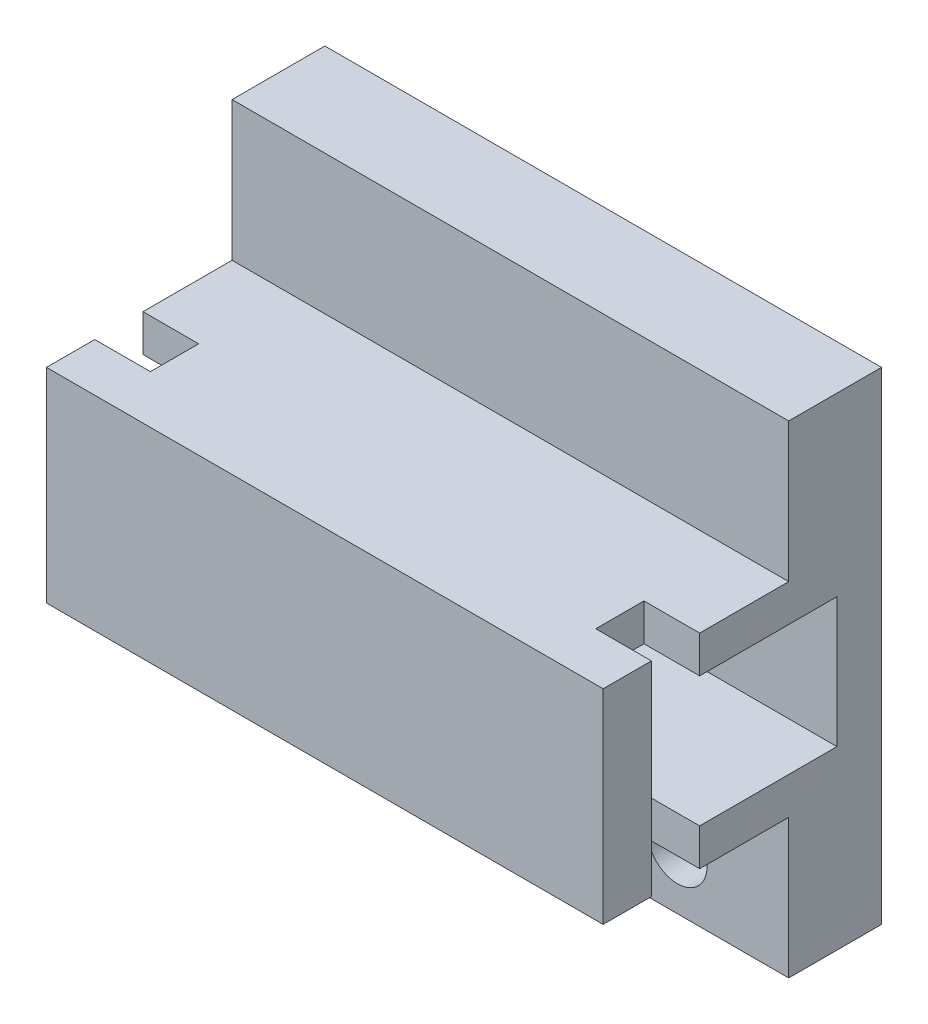
ISO-10303-21;
HEADER;
FILE_DESCRIPTION(('STEP AP214'),'2;1');
FILE_NAME('part.step','',(''),(''),'','','');
FILE_SCHEMA(('AUTOMOTIVE_DESIGN { 1 0 10303 214 1 1 1 1 }'));
ENDSEC;
DATA;
#1=APPLICATION_CONTEXT('core data for automotive mechanical design processes');
#2=APPLICATION_PROTOCOL_DEFINITION('international standard','automotive_design',2000,#1);
#3=PRODUCT_CONTEXT('',#1,'mechanical');
#4=PRODUCT('Part','Part','',(#3));
#5=PRODUCT_RELATED_PRODUCT_CATEGORY('part','',(#4));
#6=PRODUCT_DEFINITION_FORMATION('','',#4);
#7=PRODUCT_DEFINITION_CONTEXT('part definition',#1,'design');
#8=PRODUCT_DEFINITION('design','',#6,#7);
#9=PRODUCT_DEFINITION_SHAPE('','',#8);
#10=(LENGTH_UNIT() NAMED_UNIT(*) SI_UNIT(.MILLI.,.METRE.));
#11=(NAMED_UNIT(*) PLANE_ANGLE_UNIT() SI_UNIT($,.RADIAN.));
#12=(NAMED_UNIT(*) SI_UNIT($,.STERADIAN.) SOLID_ANGLE_UNIT());
#13=UNCERTAINTY_MEASURE_WITH_UNIT(LENGTH_MEASURE(1.E-05),#10,'distance_accuracy_value','');
#14=(GEOMETRIC_REPRESENTATION_CONTEXT(3) GLOBAL_UNCERTAINTY_ASSIGNED_CONTEXT((#13)) GLOBAL_UNIT_ASSIGNED_CONTEXT((#10,
#11,#12)) REPRESENTATION_CONTEXT('',''));
#15=CARTESIAN_POINT('',(0.,0.,0.));
#16=DIRECTION('',(0.,0.,1.));
#17=DIRECTION('',(1.,0.,0.));
#18=AXIS2_PLACEMENT_3D('',#15,#16,#17);
#19=CARTESIAN_POINT('',(-75.,-27.5,75.));
#20=DIRECTION('',(0.,1.,0.));
#21=DIRECTION('',(0.,0.,1.));
#22=AXIS2_PLACEMENT_3D('',#19,#20,#21);
#23=PLANE('',#22);
#24=DIRECTION('',(-1.,0.,0.));
#25=VECTOR('',#24,1.);
#26=CARTESIAN_POINT('',(-60.,-27.5,62.));
#27=LINE('',#26,#25);
#28=CARTESIAN_POINT('',(-60.,-27.5,62.));
#29=VERTEX_POINT('',#28);
#30=CARTESIAN_POINT('',(-75.,-27.5,62.));
#31=VERTEX_POINT('',#30);
#32=EDGE_CURVE('E249',#29,#31,#27,.T.);
#33=ORIENTED_EDGE('',*,*,#32,.F.);
#34=DIRECTION('',(0.,0.,-1.));
#35=VECTOR('',#34,1.);
#36=CARTESIAN_POINT('',(-60.,-27.5,62.));
#37=LINE('',#36,#35);
#38=CARTESIAN_POINT('',(-60.,-27.5,49.));
#39=VERTEX_POINT('',#38);
#40=EDGE_CURVE('E228',#29,#39,#37,.T.);
#41=ORIENTED_EDGE('',*,*,#40,.T.);
#42=DIRECTION('',(-1.,0.,0.));
#43=VECTOR('',#42,1.);
#44=CARTESIAN_POINT('',(-60.,-27.5,49.));
#45=LINE('',#44,#43);
#46=CARTESIAN_POINT('',(-75.,-27.5,49.));
#47=VERTEX_POINT('',#46);
#48=EDGE_CURVE('E251',#39,#47,#45,.T.);
#49=ORIENTED_EDGE('',*,*,#48,.T.);
#50=DIRECTION('',(0.,0.,-1.));
#51=VECTOR('',#50,1.);
#52=CARTESIAN_POINT('',(-75.,-27.5,75.));
#53=LINE('',#52,#51);
#54=CARTESIAN_POINT('',(-75.,-27.5,25.));
#55=VERTEX_POINT('',#54);
#56=EDGE_CURVE('E39',#47,#55,#53,.T.);
#57=ORIENTED_EDGE('',*,*,#56,.T.);
#58=DIRECTION('',(1.,0.,0.));
#59=VECTOR('',#58,1.);
#60=CARTESIAN_POINT('',(-75.,-27.5,25.));
#61=LINE('',#60,#59);
#62=CARTESIAN_POINT('',(-9.99999999999999,-27.5,25.));
#63=VERTEX_POINT('',#62);
#64=EDGE_CURVE('E344',#55,#63,#61,.T.);
#65=ORIENTED_EDGE('',*,*,#64,.T.);
#66=DIRECTION('',(0.,0.,-1.));
#67=VECTOR('',#66,1.);
#68=CARTESIAN_POINT('',(-9.99999999999999,-27.5,75.));
#69=LINE('',#68,#67);
#70=CARTESIAN_POINT('',(-10.,-27.5,75.));
#71=VERTEX_POINT('',#70);
#72=EDGE_CURVE('E319',#71,#63,#69,.T.);
#73=ORIENTED_EDGE('',*,*,#72,.F.);
#74=DIRECTION('',(1.,0.,0.));
#75=VECTOR('',#74,1.);
#76=CARTESIAN_POINT('',(-75.,-27.5,75.));
#77=LINE('',#76,#75);
#78=CARTESIAN_POINT('',(-75.,-27.5,75.));
#79=VERTEX_POINT('',#78);
#80=EDGE_CURVE('E349',#79,#71,#77,.T.);
#81=ORIENTED_EDGE('',*,*,#80,.F.);
#82=EDGE_CURVE('E375',#79,#31,#53,.T.);
#83=ORIENTED_EDGE('',*,*,#82,.T.);
#84=EDGE_LOOP('',(#33,#41,#49,#57,#65,#73,#81,#83));
#85=FACE_BOUND('',#84,.T.);
#86=ADVANCED_FACE('F35',(#85),#23,.F.);
#87=CARTESIAN_POINT('',(-75.,-65.,25.));
#88=DIRECTION('',(1.,0.,0.));
#89=DIRECTION('',(0.,0.,-1.));
#90=AXIS2_PLACEMENT_3D('',#87,#88,#89);
#91=PLANE('',#90);
#92=DIRECTION('',(0.,-1.,0.));
#93=VECTOR('',#92,1.);
#94=CARTESIAN_POINT('',(-75.,-65.,62.));
#95=LINE('',#94,#93);
#96=CARTESIAN_POINT('',(-75.,27.5,62.));
#97=VERTEX_POINT('',#96);
#98=EDGE_CURVE('E222',#97,#31,#95,.T.);
#99=ORIENTED_EDGE('',*,*,#98,.T.);
#100=ORIENTED_EDGE('',*,*,#82,.F.);
#101=DIRECTION('',(0.,-1.,0.));
#102=VECTOR('',#101,1.);
#103=CARTESIAN_POINT('',(-75.,-27.5,75.));
#104=LINE('',#103,#102);
#105=CARTESIAN_POINT('',(-75.,27.5,75.));
#106=VERTEX_POINT('',#105);
#107=EDGE_CURVE('E346',#106,#79,#104,.T.);
#108=ORIENTED_EDGE('',*,*,#107,.F.);
#109=DIRECTION('',(0.,0.,-1.));
#110=VECTOR('',#109,1.);
#111=CARTESIAN_POINT('',(-75.,27.5,75.));
#112=LINE('',#111,#110);
#113=EDGE_CURVE('E366',#106,#97,#112,.T.);
#114=ORIENTED_EDGE('',*,*,#113,.T.);
#115=EDGE_LOOP('',(#99,#100,#108,#114));
#116=FACE_BOUND('',#115,.T.);
#117=ADVANCED_FACE('F545',(#116),#91,.F.);
#118=DIRECTION('',(0.,1.,0.));
#119=VECTOR('',#118,1.);
#120=CARTESIAN_POINT('',(-75.,27.5,49.));
#121=LINE('',#120,#119);
#122=CARTESIAN_POINT('',(-75.,17.5,49.));
#123=VERTEX_POINT('',#122);
#124=CARTESIAN_POINT('',(-75.,27.5,49.));
#125=VERTEX_POINT('',#124);
#126=EDGE_CURVE('E248',#123,#125,#121,.T.);
#127=ORIENTED_EDGE('',*,*,#126,.T.);
#128=CARTESIAN_POINT('',(-75.,27.5,25.));
#129=VERTEX_POINT('',#128);
#130=EDGE_CURVE('E369',#125,#129,#112,.T.);
#131=ORIENTED_EDGE('',*,*,#130,.T.);
#132=DIRECTION('',(0.,-1.,0.));
#133=VECTOR('',#132,1.);
#134=CARTESIAN_POINT('',(-75.,-65.,25.));
#135=LINE('',#134,#133);
#136=CARTESIAN_POINT('',(-75.,65.,25.));
#137=VERTEX_POINT('',#136);
#138=EDGE_CURVE('E478',#137,#129,#135,.T.);
#139=ORIENTED_EDGE('',*,*,#138,.F.);
#140=DIRECTION('',(0.,0.,-1.));
#141=VECTOR('',#140,1.);
#142=CARTESIAN_POINT('',(-75.,65.,25.));
#143=LINE('',#142,#141);
#144=CARTESIAN_POINT('',(-75.,65.,0.));
#145=VERTEX_POINT('',#144);
#146=EDGE_CURVE('E498',#137,#145,#143,.T.);
#147=ORIENTED_EDGE('',*,*,#146,.T.);
#148=DIRECTION('',(0.,-1.,0.));
#149=VECTOR('',#148,1.);
#150=CARTESIAN_POINT('',(-75.,-65.,0.));
#151=LINE('',#150,#149);
#152=CARTESIAN_POINT('',(-75.,-65.,0.));
#153=VERTEX_POINT('',#152);
#154=EDGE_CURVE('E495',#145,#153,#151,.T.);
#155=ORIENTED_EDGE('',*,*,#154,.T.);
#156=DIRECTION('',(0.,0.,-1.));
#157=VECTOR('',#156,1.);
#158=CARTESIAN_POINT('',(-75.,-65.,25.));
#159=LINE('',#158,#157);
#160=CARTESIAN_POINT('',(-75.,-65.,25.));
#161=VERTEX_POINT('',#160);
#162=EDGE_CURVE('E492',#161,#153,#159,.T.);
#163=ORIENTED_EDGE('',*,*,#162,.F.);
#164=EDGE_CURVE('E363',#55,#161,#135,.T.);
#165=ORIENTED_EDGE('',*,*,#164,.F.);
#166=ORIENTED_EDGE('',*,*,#56,.F.);
#167=CARTESIAN_POINT('',(-75.,-17.5,49.));
#168=VERTEX_POINT('',#167);
#169=EDGE_CURVE('E245',#47,#168,#121,.T.);
#170=ORIENTED_EDGE('',*,*,#169,.T.);
#171=DIRECTION('',(0.,0.,-1.));
#172=VECTOR('',#171,1.);
#173=CARTESIAN_POINT('',(-75.,-17.5,25.));
#174=LINE('',#173,#172);
#175=CARTESIAN_POINT('',(-75.,-17.5,12.));
#176=VERTEX_POINT('',#175);
#177=EDGE_CURVE('E398',#168,#176,#174,.T.);
#178=ORIENTED_EDGE('',*,*,#177,.T.);
#179=DIRECTION('',(0.,1.,0.));
#180=VECTOR('',#179,1.);
#181=CARTESIAN_POINT('',(-75.,-65.,12.));
#182=LINE('',#181,#180);
#183=CARTESIAN_POINT('',(-75.,17.5,12.));
#184=VERTEX_POINT('',#183);
#185=EDGE_CURVE('E400',#176,#184,#182,.T.);
#186=ORIENTED_EDGE('',*,*,#185,.T.);
#187=DIRECTION('',(0.,0.,1.));
#188=VECTOR('',#187,1.);
#189=CARTESIAN_POINT('',(-75.,17.5,25.));
#190=LINE('',#189,#188);
#191=EDGE_CURVE('E404',#184,#123,#190,.T.);
#192=ORIENTED_EDGE('',*,*,#191,.T.);
#193=EDGE_LOOP('',(#127,#131,#139,#147,#155,#163,#165,#166,#170,#178,#186,#192));
#194=FACE_BOUND('',#193,.T.);
#195=ADVANCED_FACE('F433',(#194),#91,.F.);
#196=CARTESIAN_POINT('',(-75.,27.5,75.));
#197=DIRECTION('',(0.,-1.,0.));
#198=DIRECTION('',(0.,0.,-1.));
#199=AXIS2_PLACEMENT_3D('',#196,#197,#198);
#200=PLANE('',#199);
#201=DIRECTION('',(-1.,0.,0.));
#202=VECTOR('',#201,1.);
#203=CARTESIAN_POINT('',(-60.,27.5,62.));
#204=LINE('',#203,#202);
#205=CARTESIAN_POINT('',(-60.,27.5,62.));
#206=VERTEX_POINT('',#205);
#207=EDGE_CURVE('E216',#206,#97,#204,.T.);
#208=ORIENTED_EDGE('',*,*,#207,.T.);
#209=ORIENTED_EDGE('',*,*,#113,.F.);
#210=DIRECTION('',(-1.,0.,0.));
#211=VECTOR('',#210,1.);
#212=CARTESIAN_POINT('',(-75.,27.5,75.));
#213=LINE('',#212,#211);
#214=CARTESIAN_POINT('',(75.,27.5,75.));
#215=VERTEX_POINT('',#214);
#216=EDGE_CURVE('E343',#215,#106,#213,.T.);
#217=ORIENTED_EDGE('',*,*,#216,.F.);
#218=DIRECTION('',(0.,0.,-1.));
#219=VECTOR('',#218,1.);
#220=CARTESIAN_POINT('',(75.,27.5,75.));
#221=LINE('',#220,#219);
#222=CARTESIAN_POINT('',(75.,27.5,62.));
#223=VERTEX_POINT('',#222);
#224=EDGE_CURVE('E372',#215,#223,#221,.T.);
#225=ORIENTED_EDGE('',*,*,#224,.T.);
#226=DIRECTION('',(1.,0.,0.));
#227=VECTOR('',#226,1.);
#228=CARTESIAN_POINT('',(60.,27.5,62.));
#229=LINE('',#228,#227);
#230=CARTESIAN_POINT('',(60.,27.5,62.));
#231=VERTEX_POINT('',#230);
#232=EDGE_CURVE('E275',#231,#223,#229,.T.);
#233=ORIENTED_EDGE('',*,*,#232,.F.);
#234=DIRECTION('',(0.,0.,1.));
#235=VECTOR('',#234,1.);
#236=CARTESIAN_POINT('',(60.,27.5,62.));
#237=LINE('',#236,#235);
#238=CARTESIAN_POINT('',(60.,27.5,49.));
#239=VERTEX_POINT('',#238);
#240=EDGE_CURVE('E269',#239,#231,#237,.T.);
#241=ORIENTED_EDGE('',*,*,#240,.F.);
#242=DIRECTION('',(1.,0.,0.));
#243=VECTOR('',#242,1.);
#244=CARTESIAN_POINT('',(60.,27.5,49.));
#245=LINE('',#244,#243);
#246=CARTESIAN_POINT('',(75.,27.5,49.));
#247=VERTEX_POINT('',#246);
#248=EDGE_CURVE('E279',#239,#247,#245,.T.);
#249=ORIENTED_EDGE('',*,*,#248,.T.);
#250=CARTESIAN_POINT('',(75.,27.5,25.));
#251=VERTEX_POINT('',#250);
#252=EDGE_CURVE('E368',#247,#251,#221,.T.);
#253=ORIENTED_EDGE('',*,*,#252,.T.);
#254=DIRECTION('',(-1.,0.,0.));
#255=VECTOR('',#254,1.);
#256=CARTESIAN_POINT('',(-75.,27.5,25.));
#257=LINE('',#256,#255);
#258=EDGE_CURVE('E337',#251,#129,#257,.T.);
#259=ORIENTED_EDGE('',*,*,#258,.T.);
#260=ORIENTED_EDGE('',*,*,#130,.F.);
#261=DIRECTION('',(-1.,0.,0.));
#262=VECTOR('',#261,1.);
#263=CARTESIAN_POINT('',(-60.,27.5,49.));
#264=LINE('',#263,#262);
#265=CARTESIAN_POINT('',(-60.,27.5,49.));
#266=VERTEX_POINT('',#265);
#267=EDGE_CURVE('E227',#266,#125,#264,.T.);
#268=ORIENTED_EDGE('',*,*,#267,.F.);
#269=DIRECTION('',(0.,0.,1.));
#270=VECTOR('',#269,1.);
#271=CARTESIAN_POINT('',(-60.,27.5,62.));
#272=LINE('',#271,#270);
#273=EDGE_CURVE('E231',#266,#206,#272,.T.);
#274=ORIENTED_EDGE('',*,*,#273,.T.);
#275=EDGE_LOOP('',(#208,#209,#217,#225,#233,#241,#249,#253,#259,#260,#268,#274));
#276=FACE_BOUND('',#275,.T.);
#277=ADVANCED_FACE('F236',(#276),#200,.F.);
#278=CARTESIAN_POINT('',(-75.00005,17.5,12.));
#279=DIRECTION('',(0.,1.,0.));
#280=DIRECTION('',(0.,0.,1.));
#281=AXIS2_PLACEMENT_3D('',#278,#279,#280);
#282=PLANE('',#281);
#283=DIRECTION('',(1.,0.,0.));
#284=VECTOR('',#283,1.);
#285=CARTESIAN_POINT('',(-75.00005,17.5,49.));
#286=LINE('',#285,#284);
#287=CARTESIAN_POINT('',(-60.,17.5,49.));
#288=VERTEX_POINT('',#287);
#289=EDGE_CURVE('E256',#123,#288,#286,.T.);
#290=ORIENTED_EDGE('',*,*,#289,.F.);
#291=ORIENTED_EDGE('',*,*,#191,.F.);
#292=DIRECTION('',(1.,0.,0.));
#293=VECTOR('',#292,1.);
#294=CARTESIAN_POINT('',(-75.00005,17.5,12.));
#295=LINE('',#294,#293);
#296=CARTESIAN_POINT('',(75.,17.5,12.));
#297=VERTEX_POINT('',#296);
#298=EDGE_CURVE('E304',#184,#297,#295,.T.);
#299=ORIENTED_EDGE('',*,*,#298,.T.);
#300=DIRECTION('',(0.,0.,1.));
#301=VECTOR('',#300,1.);
#302=CARTESIAN_POINT('',(75.,17.5,12.));
#303=LINE('',#302,#301);
#304=CARTESIAN_POINT('',(75.,17.5,49.));
#305=VERTEX_POINT('',#304);
#306=EDGE_CURVE('E297',#297,#305,#303,.T.);
#307=ORIENTED_EDGE('',*,*,#306,.T.);
#308=DIRECTION('',(-1.,0.,0.));
#309=VECTOR('',#308,1.);
#310=CARTESIAN_POINT('',(-75.00005,17.5,49.));
#311=LINE('',#310,#309);
#312=CARTESIAN_POINT('',(60.,17.5,49.));
#313=VERTEX_POINT('',#312);
#314=EDGE_CURVE('E287',#305,#313,#311,.T.);
#315=ORIENTED_EDGE('',*,*,#314,.T.);
#316=DIRECTION('',(0.,0.,-1.));
#317=VECTOR('',#316,1.);
#318=CARTESIAN_POINT('',(60.,17.5,12.));
#319=LINE('',#318,#317);
#320=CARTESIAN_POINT('',(60.,17.5,62.));
#321=VERTEX_POINT('',#320);
#322=EDGE_CURVE('E278',#321,#313,#319,.T.);
#323=ORIENTED_EDGE('',*,*,#322,.F.);
#324=DIRECTION('',(1.,0.,0.));
#325=VECTOR('',#324,1.);
#326=CARTESIAN_POINT('',(-75.00005,17.5,62.));
#327=LINE('',#326,#325);
#328=CARTESIAN_POINT('',(-60.,17.5,62.));
#329=VERTEX_POINT('',#328);
#330=EDGE_CURVE('E301',#329,#321,#327,.T.);
#331=ORIENTED_EDGE('',*,*,#330,.F.);
#332=DIRECTION('',(0.,0.,1.));
#333=VECTOR('',#332,1.);
#334=CARTESIAN_POINT('',(-60.,17.5,12.));
#335=LINE('',#334,#333);
#336=EDGE_CURVE('E234',#288,#329,#335,.T.);
#337=ORIENTED_EDGE('',*,*,#336,.F.);
#338=EDGE_LOOP('',(#290,#291,#299,#307,#315,#323,#331,#337));
#339=FACE_BOUND('',#338,.T.);
#340=ADVANCED_FACE('F621',(#339),#282,.F.);
#341=CARTESIAN_POINT('',(-75.00005,-17.5,12.));
#342=DIRECTION('',(0.,-1.,0.));
#343=DIRECTION('',(0.,0.,-1.));
#344=AXIS2_PLACEMENT_3D('',#341,#342,#343);
#345=PLANE('',#344);
#346=DIRECTION('',(-1.,0.,0.));
#347=VECTOR('',#346,1.);
#348=CARTESIAN_POINT('',(-75.00005,-17.5,49.));
#349=LINE('',#348,#347);
#350=CARTESIAN_POINT('',(-60.,-17.5,49.));
#351=VERTEX_POINT('',#350);
#352=EDGE_CURVE('E11',#351,#168,#349,.T.);
#353=ORIENTED_EDGE('',*,*,#352,.F.);
#354=DIRECTION('',(0.,0.,-1.));
#355=VECTOR('',#354,1.);
#356=CARTESIAN_POINT('',(-60.,-17.5,12.));
#357=LINE('',#356,#355);
#358=CARTESIAN_POINT('',(-60.,-17.5,62.));
#359=VERTEX_POINT('',#358);
#360=EDGE_CURVE('E45',#359,#351,#357,.T.);
#361=ORIENTED_EDGE('',*,*,#360,.F.);
#362=DIRECTION('',(1.,0.,0.));
#363=VECTOR('',#362,1.);
#364=CARTESIAN_POINT('',(-75.00005,-17.5,62.));
#365=LINE('',#364,#363);
#366=CARTESIAN_POINT('',(60.,-17.5,62.));
#367=VERTEX_POINT('',#366);
#368=EDGE_CURVE('E300',#359,#367,#365,.T.);
#369=ORIENTED_EDGE('',*,*,#368,.T.);
#370=DIRECTION('',(0.,0.,1.));
#371=VECTOR('',#370,1.);
#372=CARTESIAN_POINT('',(60.,-17.5,12.));
#373=LINE('',#372,#371);
#374=CARTESIAN_POINT('',(60.,-17.5,49.));
#375=VERTEX_POINT('',#374);
#376=EDGE_CURVE('E408',#375,#367,#373,.T.);
#377=ORIENTED_EDGE('',*,*,#376,.F.);
#378=DIRECTION('',(1.,0.,0.));
#379=VECTOR('',#378,1.);
#380=CARTESIAN_POINT('',(-75.00005,-17.5,49.));
#381=LINE('',#380,#379);
#382=CARTESIAN_POINT('',(75.,-17.5,49.));
#383=VERTEX_POINT('',#382);
#384=EDGE_CURVE('E378',#375,#383,#381,.T.);
#385=ORIENTED_EDGE('',*,*,#384,.T.);
#386=DIRECTION('',(0.,0.,-1.));
#387=VECTOR('',#386,1.);
#388=CARTESIAN_POINT('',(75.,-17.5,12.));
#389=LINE('',#388,#387);
#390=CARTESIAN_POINT('',(75.,-17.5,12.));
#391=VERTEX_POINT('',#390);
#392=EDGE_CURVE('E292',#383,#391,#389,.T.);
#393=ORIENTED_EDGE('',*,*,#392,.T.);
#394=DIRECTION('',(1.,0.,0.));
#395=VECTOR('',#394,1.);
#396=CARTESIAN_POINT('',(-75.00005,-17.5,12.));
#397=LINE('',#396,#395);
#398=EDGE_CURVE('E306',#176,#391,#397,.T.);
#399=ORIENTED_EDGE('',*,*,#398,.F.);
#400=ORIENTED_EDGE('',*,*,#177,.F.);
#401=EDGE_LOOP('',(#353,#361,#369,#377,#385,#393,#399,#400));
#402=FACE_BOUND('',#401,.T.);
#403=ADVANCED_FACE('F416',(#402),#345,.F.);
#404=CARTESIAN_POINT('',(75.,-65.,25.));
#405=DIRECTION('',(-1.,0.,0.));
#406=DIRECTION('',(0.,0.,1.));
#407=AXIS2_PLACEMENT_3D('',#404,#405,#406);
#408=PLANE('',#407);
#409=DIRECTION('',(0.,0.,-1.));
#410=VECTOR('',#409,1.);
#411=CARTESIAN_POINT('',(75.,-27.5,75.));
#412=LINE('',#411,#410);
#413=CARTESIAN_POINT('',(75.,-27.5,75.));
#414=VERTEX_POINT('',#413);
#415=CARTESIAN_POINT('',(75.,-27.5,62.));
#416=VERTEX_POINT('',#415);
#417=EDGE_CURVE('E387',#414,#416,#412,.T.);
#418=ORIENTED_EDGE('',*,*,#417,.T.);
#419=DIRECTION('',(0.,-1.,0.));
#420=VECTOR('',#419,1.);
#421=CARTESIAN_POINT('',(75.,-17.5,62.));
#422=LINE('',#421,#420);
#423=EDGE_CURVE('E290',#223,#416,#422,.T.);
#424=ORIENTED_EDGE('',*,*,#423,.F.);
#425=ORIENTED_EDGE('',*,*,#224,.F.);
#426=DIRECTION('',(0.,1.,0.));
#427=VECTOR('',#426,1.);
#428=CARTESIAN_POINT('',(75.,-27.5,75.));
#429=LINE('',#428,#427);
#430=EDGE_CURVE('E340',#414,#215,#429,.T.);
#431=ORIENTED_EDGE('',*,*,#430,.F.);
#432=EDGE_LOOP('',(#418,#424,#425,#431));
#433=FACE_BOUND('',#432,.T.);
#434=ADVANCED_FACE('F533',(#433),#408,.F.);
#435=CARTESIAN_POINT('',(0.,0.,25.));
#436=DIRECTION('',(0.,0.,-1.));
#437=DIRECTION('',(-1.,0.,0.));
#438=AXIS2_PLACEMENT_3D('',#435,#436,#437);
#439=PLANE('',#438);
#440=DIRECTION('',(0.,-1.,0.));
#441=VECTOR('',#440,1.);
#442=CARTESIAN_POINT('',(-10.,0.,25.));
#443=LINE('',#442,#441);
#444=CARTESIAN_POINT('',(-10.,-65.,25.));
#445=VERTEX_POINT('',#444);
#446=EDGE_CURVE('E323',#63,#445,#443,.T.);
#447=ORIENTED_EDGE('',*,*,#446,.F.);
#448=ORIENTED_EDGE('',*,*,#64,.F.);
#449=ORIENTED_EDGE('',*,*,#164,.T.);
#450=DIRECTION('',(1.,0.,0.));
#451=VECTOR('',#450,1.);
#452=CARTESIAN_POINT('',(-75.,-65.,25.));
#453=LINE('',#452,#451);
#454=EDGE_CURVE('E475',#161,#445,#453,.T.);
#455=ORIENTED_EDGE('',*,*,#454,.T.);
#456=EDGE_LOOP('',(#447,#448,#449,#455));
#457=FACE_BOUND('',#456,.T.);
#458=CARTESIAN_POINT('',(-45.,-50.,25.));
#459=DIRECTION('',(0.,0.,-1.));
#460=DIRECTION('',(-1.,0.,0.));
#461=AXIS2_PLACEMENT_3D('',#458,#459,#460);
#462=CIRCLE('',#461,8.);
#463=CARTESIAN_POINT('',(-53.,-50.,25.));
#464=VERTEX_POINT('',#463);
#465=EDGE_CURVE('E303',#464,#464,#462,.T.);
#466=ORIENTED_EDGE('',*,*,#465,.T.);
#467=EDGE_LOOP('',(#466));
#468=FACE_BOUND('',#467,.T.);
#469=ADVANCED_FACE('F488',(#457,#468),#439,.F.);
#470=CARTESIAN_POINT('',(0.,0.,0.));
#471=DIRECTION('',(0.,0.,-1.));
#472=DIRECTION('',(-1.,0.,0.));
#473=AXIS2_PLACEMENT_3D('',#470,#471,#472);
#474=PLANE('',#473);
#475=CARTESIAN_POINT('',(45.,-50.,0.));
#476=DIRECTION('',(0.,0.,1.));
#477=DIRECTION('',(1.,0.,0.));
#478=AXIS2_PLACEMENT_3D('',#475,#476,#477);
#479=CIRCLE('',#478,8.);
#480=CARTESIAN_POINT('',(53.,-50.,0.));
#481=VERTEX_POINT('',#480);
#482=EDGE_CURVE('E334',#481,#481,#479,.T.);
#483=ORIENTED_EDGE('',*,*,#482,.T.);
#484=EDGE_LOOP('',(#483));
#485=FACE_BOUND('',#484,.T.);
#486=DIRECTION('',(0.,1.,0.));
#487=VECTOR('',#486,1.);
#488=CARTESIAN_POINT('',(75.,-65.,0.));
#489=LINE('',#488,#487);
#490=CARTESIAN_POINT('',(75.,-65.,0.));
#491=VERTEX_POINT('',#490);
#492=CARTESIAN_POINT('',(75.,65.,0.));
#493=VERTEX_POINT('',#492);
#494=EDGE_CURVE('E514',#491,#493,#489,.T.);
#495=ORIENTED_EDGE('',*,*,#494,.F.);
#496=DIRECTION('',(1.,0.,0.));
#497=VECTOR('',#496,1.);
#498=CARTESIAN_POINT('',(-75.,-65.,0.));
#499=LINE('',#498,#497);
#500=EDGE_CURVE('E467',#153,#491,#499,.T.);
#501=ORIENTED_EDGE('',*,*,#500,.F.);
#502=ORIENTED_EDGE('',*,*,#154,.F.);
#503=DIRECTION('',(-1.,0.,0.));
#504=VECTOR('',#503,1.);
#505=CARTESIAN_POINT('',(-75.,65.,0.));
#506=LINE('',#505,#504);
#507=EDGE_CURVE('E512',#493,#145,#506,.T.);
#508=ORIENTED_EDGE('',*,*,#507,.F.);
#509=EDGE_LOOP('',(#495,#501,#502,#508));
#510=FACE_BOUND('',#509,.T.);
#511=CARTESIAN_POINT('',(-45.,-50.,0.));
#512=DIRECTION('',(0.,0.,-1.));
#513=DIRECTION('',(-1.,0.,0.));
#514=AXIS2_PLACEMENT_3D('',#511,#512,#513);
#515=CIRCLE('',#514,8.);
#516=CARTESIAN_POINT('',(-53.,-50.,0.));
#517=VERTEX_POINT('',#516);
#518=EDGE_CURVE('E310',#517,#517,#515,.T.);
#519=ORIENTED_EDGE('',*,*,#518,.F.);
#520=EDGE_LOOP('',(#519));
#521=FACE_BOUND('',#520,.T.);
#522=ADVANCED_FACE('F518',(#485,#510,#521),#474,.T.);
#523=CARTESIAN_POINT('',(45.,-50.,25.));
#524=DIRECTION('',(0.,0.,1.));
#525=DIRECTION('',(1.,0.,0.));
#526=AXIS2_PLACEMENT_3D('',#523,#524,#525);
#527=CIRCLE('',#526,8.);
#528=CARTESIAN_POINT('',(53.,-50.,25.));
#529=VERTEX_POINT('',#528);
#530=EDGE_CURVE('E333',#529,#529,#527,.T.);
#531=ORIENTED_EDGE('',*,*,#530,.F.);
#532=EDGE_LOOP('',(#531));
#533=FACE_BOUND('',#532,.T.);
#534=CARTESIAN_POINT('',(9.99999999999999,-27.5,25.));
#535=VERTEX_POINT('',#534);
#536=CARTESIAN_POINT('',(75.,-27.5,25.));
#537=VERTEX_POINT('',#536);
#538=EDGE_CURVE('E362',#535,#537,#61,.T.);
#539=ORIENTED_EDGE('',*,*,#538,.F.);
#540=DIRECTION('',(0.,-1.,0.));
#541=VECTOR('',#540,1.);
#542=CARTESIAN_POINT('',(10.,0.,25.));
#543=LINE('',#542,#541);
#544=CARTESIAN_POINT('',(10.,-65.,25.));
#545=VERTEX_POINT('',#544);
#546=EDGE_CURVE('E328',#535,#545,#543,.T.);
#547=ORIENTED_EDGE('',*,*,#546,.T.);
#548=CARTESIAN_POINT('',(75.,-65.,25.));
#549=VERTEX_POINT('',#548);
#550=EDGE_CURVE('E480',#545,#549,#453,.T.);
#551=ORIENTED_EDGE('',*,*,#550,.T.);
#552=DIRECTION('',(0.,1.,0.));
#553=VECTOR('',#552,1.);
#554=CARTESIAN_POINT('',(75.,-65.,25.));
#555=LINE('',#554,#553);
#556=EDGE_CURVE('E457',#549,#537,#555,.T.);
#557=ORIENTED_EDGE('',*,*,#556,.T.);
#558=EDGE_LOOP('',(#539,#547,#551,#557));
#559=FACE_BOUND('',#558,.T.);
#560=ADVANCED_FACE('F521',(#533,#559),#439,.F.);
#561=DIRECTION('',(-1.,0.,0.));
#562=VECTOR('',#561,1.);
#563=CARTESIAN_POINT('',(-75.,65.,25.));
#564=LINE('',#563,#562);
#565=CARTESIAN_POINT('',(75.,65.,25.));
#566=VERTEX_POINT('',#565);
#567=EDGE_CURVE('E463',#566,#137,#564,.T.);
#568=ORIENTED_EDGE('',*,*,#567,.T.);
#569=ORIENTED_EDGE('',*,*,#138,.T.);
#570=ORIENTED_EDGE('',*,*,#258,.F.);
#571=EDGE_CURVE('E464',#251,#566,#555,.T.);
#572=ORIENTED_EDGE('',*,*,#571,.T.);
#573=EDGE_LOOP('',(#568,#569,#570,#572));
#574=FACE_BOUND('',#573,.T.);
#575=ADVANCED_FACE('F535',(#574),#439,.F.);
#576=ORIENTED_EDGE('',*,*,#252,.F.);
#577=DIRECTION('',(0.,1.,0.));
#578=VECTOR('',#577,1.);
#579=CARTESIAN_POINT('',(75.,27.5,49.));
#580=LINE('',#579,#578);
#581=EDGE_CURVE('E258',#305,#247,#580,.T.);
#582=ORIENTED_EDGE('',*,*,#581,.F.);
#583=ORIENTED_EDGE('',*,*,#306,.F.);
#584=DIRECTION('',(0.,1.,0.));
#585=VECTOR('',#584,1.);
#586=CARTESIAN_POINT('',(75.,-17.5,12.));
#587=LINE('',#586,#585);
#588=EDGE_CURVE('E294',#391,#297,#587,.T.);
#589=ORIENTED_EDGE('',*,*,#588,.F.);
#590=ORIENTED_EDGE('',*,*,#392,.F.);
#591=CARTESIAN_POINT('',(75.,-27.5,49.));
#592=VERTEX_POINT('',#591);
#593=EDGE_CURVE('E273',#592,#383,#580,.T.);
#594=ORIENTED_EDGE('',*,*,#593,.F.);
#595=EDGE_CURVE('E352',#592,#537,#412,.T.);
#596=ORIENTED_EDGE('',*,*,#595,.T.);
#597=ORIENTED_EDGE('',*,*,#556,.F.);
#598=DIRECTION('',(0.,0.,-1.));
#599=VECTOR('',#598,1.);
#600=CARTESIAN_POINT('',(75.,-65.,25.));
#601=LINE('',#600,#599);
#602=EDGE_CURVE('E460',#549,#491,#601,.T.);
#603=ORIENTED_EDGE('',*,*,#602,.T.);
#604=ORIENTED_EDGE('',*,*,#494,.T.);
#605=DIRECTION('',(0.,0.,-1.));
#606=VECTOR('',#605,1.);
#607=CARTESIAN_POINT('',(75.,65.,25.));
#608=LINE('',#607,#606);
#609=EDGE_CURVE('E401',#566,#493,#608,.T.);
#610=ORIENTED_EDGE('',*,*,#609,.F.);
#611=ORIENTED_EDGE('',*,*,#571,.F.);
#612=EDGE_LOOP('',(#576,#582,#583,#589,#590,#594,#596,#597,#603,#604,#610,#611));
#613=FACE_BOUND('',#612,.T.);
#614=ADVANCED_FACE('F37',(#613),#408,.F.);
#615=CARTESIAN_POINT('',(-75.,65.,25.));
#616=DIRECTION('',(0.,-1.,0.));
#617=DIRECTION('',(0.,0.,-1.));
#618=AXIS2_PLACEMENT_3D('',#615,#616,#617);
#619=PLANE('',#618);
#620=ORIENTED_EDGE('',*,*,#507,.T.);
#621=ORIENTED_EDGE('',*,*,#146,.F.);
#622=ORIENTED_EDGE('',*,*,#567,.F.);
#623=ORIENTED_EDGE('',*,*,#609,.T.);
#624=EDGE_LOOP('',(#620,#621,#622,#623));
#625=FACE_BOUND('',#624,.T.);
#626=ADVANCED_FACE('F511',(#625),#619,.F.);
#627=CARTESIAN_POINT('',(-75.,-65.,25.));
#628=DIRECTION('',(0.,1.,0.));
#629=DIRECTION('',(0.,0.,1.));
#630=AXIS2_PLACEMENT_3D('',#627,#628,#629);
#631=PLANE('',#630);
#632=ORIENTED_EDGE('',*,*,#550,.F.);
#633=DIRECTION('',(1.,0.,0.));
#634=VECTOR('',#633,1.);
#635=CARTESIAN_POINT('',(-75.,-65.,25.));
#636=LINE('',#635,#634);
#637=EDGE_CURVE('E331',#445,#545,#636,.T.);
#638=ORIENTED_EDGE('',*,*,#637,.F.);
#639=ORIENTED_EDGE('',*,*,#454,.F.);
#640=ORIENTED_EDGE('',*,*,#162,.T.);
#641=ORIENTED_EDGE('',*,*,#500,.T.);
#642=ORIENTED_EDGE('',*,*,#602,.F.);
#643=EDGE_LOOP('',(#632,#638,#639,#640,#641,#642));
#644=FACE_BOUND('',#643,.T.);
#645=ADVANCED_FACE('F502',(#644),#631,.F.);
#646=DIRECTION('',(0.,0.,-1.));
#647=VECTOR('',#646,1.);
#648=CARTESIAN_POINT('',(60.,-27.5,62.));
#649=LINE('',#648,#647);
#650=CARTESIAN_POINT('',(60.,-27.5,62.));
#651=VERTEX_POINT('',#650);
#652=CARTESIAN_POINT('',(60.,-27.5,49.));
#653=VERTEX_POINT('',#652);
#654=EDGE_CURVE('E262',#651,#653,#649,.T.);
#655=ORIENTED_EDGE('',*,*,#654,.F.);
#656=DIRECTION('',(1.,0.,0.));
#657=VECTOR('',#656,1.);
#658=CARTESIAN_POINT('',(60.,-27.5,62.));
#659=LINE('',#658,#657);
#660=EDGE_CURVE('E272',#651,#416,#659,.T.);
#661=ORIENTED_EDGE('',*,*,#660,.T.);
#662=ORIENTED_EDGE('',*,*,#417,.F.);
#663=CARTESIAN_POINT('',(9.99999999999999,-27.5,75.));
#664=VERTEX_POINT('',#663);
#665=EDGE_CURVE('E348',#664,#414,#77,.T.);
#666=ORIENTED_EDGE('',*,*,#665,.F.);
#667=DIRECTION('',(0.,0.,-1.));
#668=VECTOR('',#667,1.);
#669=CARTESIAN_POINT('',(9.99999999999999,-27.5,75.));
#670=LINE('',#669,#668);
#671=EDGE_CURVE('E325',#664,#535,#670,.T.);
#672=ORIENTED_EDGE('',*,*,#671,.T.);
#673=ORIENTED_EDGE('',*,*,#538,.T.);
#674=ORIENTED_EDGE('',*,*,#595,.F.);
#675=DIRECTION('',(1.,0.,0.));
#676=VECTOR('',#675,1.);
#677=CARTESIAN_POINT('',(60.,-27.5,49.));
#678=LINE('',#677,#676);
#679=EDGE_CURVE('E282',#653,#592,#678,.T.);
#680=ORIENTED_EDGE('',*,*,#679,.F.);
#681=EDGE_LOOP('',(#655,#661,#662,#666,#672,#673,#674,#680));
#682=FACE_BOUND('',#681,.T.);
#683=ADVANCED_FACE('F452',(#682),#23,.F.);
#684=CARTESIAN_POINT('',(0.,0.,75.));
#685=DIRECTION('',(0.,0.,-1.));
#686=DIRECTION('',(-1.,0.,0.));
#687=AXIS2_PLACEMENT_3D('',#684,#685,#686);
#688=PLANE('',#687);
#689=ORIENTED_EDGE('',*,*,#216,.T.);
#690=ORIENTED_EDGE('',*,*,#107,.T.);
#691=ORIENTED_EDGE('',*,*,#80,.T.);
#692=EDGE_CURVE('E353',#71,#664,#77,.T.);
#693=ORIENTED_EDGE('',*,*,#692,.T.);
#694=ORIENTED_EDGE('',*,*,#665,.T.);
#695=ORIENTED_EDGE('',*,*,#430,.T.);
#696=EDGE_LOOP('',(#689,#690,#691,#693,#694,#695));
#697=FACE_BOUND('',#696,.T.);
#698=ADVANCED_FACE('F554',(#697),#688,.F.);
#699=CARTESIAN_POINT('',(45.,-50.,0.));
#700=DIRECTION('',(0.,0.,1.));
#701=DIRECTION('',(1.,0.,0.));
#702=AXIS2_PLACEMENT_3D('',#699,#700,#701);
#703=CYLINDRICAL_SURFACE('',#702,8.);
#704=ORIENTED_EDGE('',*,*,#482,.F.);
#705=EDGE_LOOP('',(#704));
#706=FACE_BOUND('',#705,.T.);
#707=ORIENTED_EDGE('',*,*,#530,.T.);
#708=EDGE_LOOP('',(#707));
#709=FACE_BOUND('',#708,.T.);
#710=ADVANCED_FACE('F559',(#706,#709),#703,.F.);
#711=CARTESIAN_POINT('',(10.,0.,37.5000125));
#712=DIRECTION('',(1.,0.,0.));
#713=DIRECTION('',(0.,0.,-1.));
#714=AXIS2_PLACEMENT_3D('',#711,#712,#713);
#715=PLANE('',#714);
#716=ORIENTED_EDGE('',*,*,#546,.F.);
#717=ORIENTED_EDGE('',*,*,#671,.F.);
#718=DIRECTION('',(0.,-0.6,-0.8));
#719=VECTOR('',#718,1.);
#720=CARTESIAN_POINT('',(10.,-27.5,75.));
#721=LINE('',#720,#719);
#722=EDGE_CURVE('E316',#664,#545,#721,.T.);
#723=ORIENTED_EDGE('',*,*,#722,.T.);
#724=EDGE_LOOP('',(#716,#717,#723));
#725=FACE_BOUND('',#724,.T.);
#726=ADVANCED_FACE('F706',(#725),#715,.T.);
#727=CARTESIAN_POINT('',(-10.,0.,37.5000125));
#728=DIRECTION('',(1.,0.,0.));
#729=DIRECTION('',(0.,0.,-1.));
#730=AXIS2_PLACEMENT_3D('',#727,#728,#729);
#731=PLANE('',#730);
#732=ORIENTED_EDGE('',*,*,#72,.T.);
#733=ORIENTED_EDGE('',*,*,#446,.T.);
#734=DIRECTION('',(0.,-0.6,-0.8));
#735=VECTOR('',#734,1.);
#736=CARTESIAN_POINT('',(-10.,-27.5,75.));
#737=LINE('',#736,#735);
#738=EDGE_CURVE('E313',#71,#445,#737,.T.);
#739=ORIENTED_EDGE('',*,*,#738,.F.);
#740=EDGE_LOOP('',(#732,#733,#739));
#741=FACE_BOUND('',#740,.T.);
#742=ADVANCED_FACE('F714',(#741),#731,.F.);
#743=CARTESIAN_POINT('',(0.,-27.5,75.));
#744=DIRECTION('',(0.,-0.8,0.6));
#745=DIRECTION('',(0.,-0.6,-0.8));
#746=AXIS2_PLACEMENT_3D('',#743,#744,#745);
#747=PLANE('',#746);
#748=ORIENTED_EDGE('',*,*,#738,.T.);
#749=ORIENTED_EDGE('',*,*,#637,.T.);
#750=ORIENTED_EDGE('',*,*,#722,.F.);
#751=ORIENTED_EDGE('',*,*,#692,.F.);
#752=EDGE_LOOP('',(#748,#749,#750,#751));
#753=FACE_BOUND('',#752,.T.);
#754=ADVANCED_FACE('F529',(#753),#747,.T.);
#755=CARTESIAN_POINT('',(-45.,-50.,0.));
#756=DIRECTION('',(0.,0.,1.));
#757=DIRECTION('',(1.,0.,0.));
#758=AXIS2_PLACEMENT_3D('',#755,#756,#757);
#759=CYLINDRICAL_SURFACE('',#758,8.);
#760=ORIENTED_EDGE('',*,*,#518,.T.);
#761=EDGE_LOOP('',(#760));
#762=FACE_BOUND('',#761,.T.);
#763=ORIENTED_EDGE('',*,*,#465,.F.);
#764=EDGE_LOOP('',(#763));
#765=FACE_BOUND('',#764,.T.);
#766=ADVANCED_FACE('F526',(#762,#765),#759,.F.);
#767=CARTESIAN_POINT('',(-75.00005,-17.5,62.));
#768=DIRECTION('',(0.,0.,1.));
#769=DIRECTION('',(1.,0.,0.));
#770=AXIS2_PLACEMENT_3D('',#767,#768,#769);
#771=PLANE('',#770);
#772=ORIENTED_EDGE('',*,*,#98,.F.);
#773=ORIENTED_EDGE('',*,*,#207,.F.);
#774=DIRECTION('',(0.,-1.,0.));
#775=VECTOR('',#774,1.);
#776=CARTESIAN_POINT('',(-60.,27.5,62.));
#777=LINE('',#776,#775);
#778=EDGE_CURVE('E219',#206,#329,#777,.T.);
#779=ORIENTED_EDGE('',*,*,#778,.T.);
#780=ORIENTED_EDGE('',*,*,#330,.T.);
#781=DIRECTION('',(0.,-1.,0.));
#782=VECTOR('',#781,1.);
#783=CARTESIAN_POINT('',(60.,27.5,62.));
#784=LINE('',#783,#782);
#785=EDGE_CURVE('E259',#231,#321,#784,.T.);
#786=ORIENTED_EDGE('',*,*,#785,.F.);
#787=ORIENTED_EDGE('',*,*,#232,.T.);
#788=ORIENTED_EDGE('',*,*,#423,.T.);
#789=ORIENTED_EDGE('',*,*,#660,.F.);
#790=EDGE_CURVE('E263',#367,#651,#784,.T.);
#791=ORIENTED_EDGE('',*,*,#790,.F.);
#792=ORIENTED_EDGE('',*,*,#368,.F.);
#793=EDGE_CURVE('E61',#359,#29,#777,.T.);
#794=ORIENTED_EDGE('',*,*,#793,.T.);
#795=ORIENTED_EDGE('',*,*,#32,.T.);
#796=EDGE_LOOP('',(#772,#773,#779,#780,#786,#787,#788,#789,#791,#792,#794,#795));
#797=FACE_BOUND('',#796,.T.);
#798=ADVANCED_FACE('F218',(#797),#771,.F.);
#799=CARTESIAN_POINT('',(-75.00005,-17.5,12.));
#800=DIRECTION('',(0.,0.,-1.));
#801=DIRECTION('',(-1.,0.,0.));
#802=AXIS2_PLACEMENT_3D('',#799,#800,#801);
#803=PLANE('',#802);
#804=ORIENTED_EDGE('',*,*,#398,.T.);
#805=ORIENTED_EDGE('',*,*,#588,.T.);
#806=ORIENTED_EDGE('',*,*,#298,.F.);
#807=ORIENTED_EDGE('',*,*,#185,.F.);
#808=EDGE_LOOP('',(#804,#805,#806,#807));
#809=FACE_BOUND('',#808,.T.);
#810=ADVANCED_FACE('F428',(#809),#803,.F.);
#811=CARTESIAN_POINT('',(60.,0.,0.));
#812=DIRECTION('',(1.,0.,0.));
#813=DIRECTION('',(0.,0.,-1.));
#814=AXIS2_PLACEMENT_3D('',#811,#812,#813);
#815=PLANE('',#814);
#816=ORIENTED_EDGE('',*,*,#376,.T.);
#817=ORIENTED_EDGE('',*,*,#790,.T.);
#818=ORIENTED_EDGE('',*,*,#654,.T.);
#819=DIRECTION('',(0.,1.,0.));
#820=VECTOR('',#819,1.);
#821=CARTESIAN_POINT('',(60.,27.5,49.));
#822=LINE('',#821,#820);
#823=EDGE_CURVE('E267',#653,#375,#822,.T.);
#824=ORIENTED_EDGE('',*,*,#823,.T.);
#825=EDGE_LOOP('',(#816,#817,#818,#824));
#826=FACE_BOUND('',#825,.T.);
#827=ADVANCED_FACE('F448',(#826),#815,.T.);
#828=CARTESIAN_POINT('',(60.,27.5,49.));
#829=DIRECTION('',(0.,0.,-1.));
#830=DIRECTION('',(0.,1.,0.));
#831=AXIS2_PLACEMENT_3D('',#828,#829,#830);
#832=PLANE('',#831);
#833=ORIENTED_EDGE('',*,*,#823,.F.);
#834=ORIENTED_EDGE('',*,*,#679,.T.);
#835=ORIENTED_EDGE('',*,*,#593,.T.);
#836=ORIENTED_EDGE('',*,*,#384,.F.);
#837=EDGE_LOOP('',(#833,#834,#835,#836));
#838=FACE_BOUND('',#837,.T.);
#839=ADVANCED_FACE('F450',(#838),#832,.F.);
#840=ORIENTED_EDGE('',*,*,#581,.T.);
#841=ORIENTED_EDGE('',*,*,#248,.F.);
#842=EDGE_CURVE('E266',#313,#239,#822,.T.);
#843=ORIENTED_EDGE('',*,*,#842,.F.);
#844=ORIENTED_EDGE('',*,*,#314,.F.);
#845=EDGE_LOOP('',(#840,#841,#843,#844));
#846=FACE_BOUND('',#845,.T.);
#847=ADVANCED_FACE('F660',(#846),#832,.F.);
#848=ORIENTED_EDGE('',*,*,#322,.T.);
#849=ORIENTED_EDGE('',*,*,#842,.T.);
#850=ORIENTED_EDGE('',*,*,#240,.T.);
#851=ORIENTED_EDGE('',*,*,#785,.T.);
#852=EDGE_LOOP('',(#848,#849,#850,#851));
#853=FACE_BOUND('',#852,.T.);
#854=ADVANCED_FACE('F655',(#853),#815,.T.);
#855=CARTESIAN_POINT('',(-60.,0.,0.));
#856=DIRECTION('',(-1.,0.,0.));
#857=DIRECTION('',(0.,0.,-1.));
#858=AXIS2_PLACEMENT_3D('',#855,#856,#857);
#859=PLANE('',#858);
#860=ORIENTED_EDGE('',*,*,#360,.T.);
#861=DIRECTION('',(0.,1.,0.));
#862=VECTOR('',#861,1.);
#863=CARTESIAN_POINT('',(-60.,27.5,49.));
#864=LINE('',#863,#862);
#865=EDGE_CURVE('E239',#39,#351,#864,.T.);
#866=ORIENTED_EDGE('',*,*,#865,.F.);
#867=ORIENTED_EDGE('',*,*,#40,.F.);
#868=ORIENTED_EDGE('',*,*,#793,.F.);
#869=EDGE_LOOP('',(#860,#866,#867,#868));
#870=FACE_BOUND('',#869,.T.);
#871=ADVANCED_FACE('F442',(#870),#859,.T.);
#872=CARTESIAN_POINT('',(-60.,27.5,49.));
#873=DIRECTION('',(0.,0.,1.));
#874=DIRECTION('',(0.,-1.,0.));
#875=AXIS2_PLACEMENT_3D('',#872,#873,#874);
#876=PLANE('',#875);
#877=ORIENTED_EDGE('',*,*,#352,.T.);
#878=ORIENTED_EDGE('',*,*,#169,.F.);
#879=ORIENTED_EDGE('',*,*,#48,.F.);
#880=ORIENTED_EDGE('',*,*,#865,.T.);
#881=EDGE_LOOP('',(#877,#878,#879,#880));
#882=FACE_BOUND('',#881,.T.);
#883=ADVANCED_FACE('F437',(#882),#876,.T.);
#884=ORIENTED_EDGE('',*,*,#289,.T.);
#885=EDGE_CURVE('E53',#288,#266,#864,.T.);
#886=ORIENTED_EDGE('',*,*,#885,.T.);
#887=ORIENTED_EDGE('',*,*,#267,.T.);
#888=ORIENTED_EDGE('',*,*,#126,.F.);
#889=EDGE_LOOP('',(#884,#886,#887,#888));
#890=FACE_BOUND('',#889,.T.);
#891=ADVANCED_FACE('F737',(#890),#876,.T.);
#892=ORIENTED_EDGE('',*,*,#336,.T.);
#893=ORIENTED_EDGE('',*,*,#778,.F.);
#894=ORIENTED_EDGE('',*,*,#273,.F.);
#895=ORIENTED_EDGE('',*,*,#885,.F.);
#896=EDGE_LOOP('',(#892,#893,#894,#895));
#897=FACE_BOUND('',#896,.T.);
#898=ADVANCED_FACE('F230',(#897),#859,.T.);
#899=CLOSED_SHELL('',(#86,#117,#195,#277,#340,#403,#434,#469,#522,#560,#575,#614,#626,#645,#683,
#698,#710,#726,#742,#754,#766,#798,#810,#827,#839,#847,#854,#871,#883,#891,#898));
#900=MANIFOLD_SOLID_BREP('B2',#899);
#901=ADVANCED_BREP_SHAPE_REPRESENTATION('',(#18,#900),#14);
#902=SHAPE_DEFINITION_REPRESENTATION(#9,#901);
ENDSEC;
END-ISO-10303-21;
